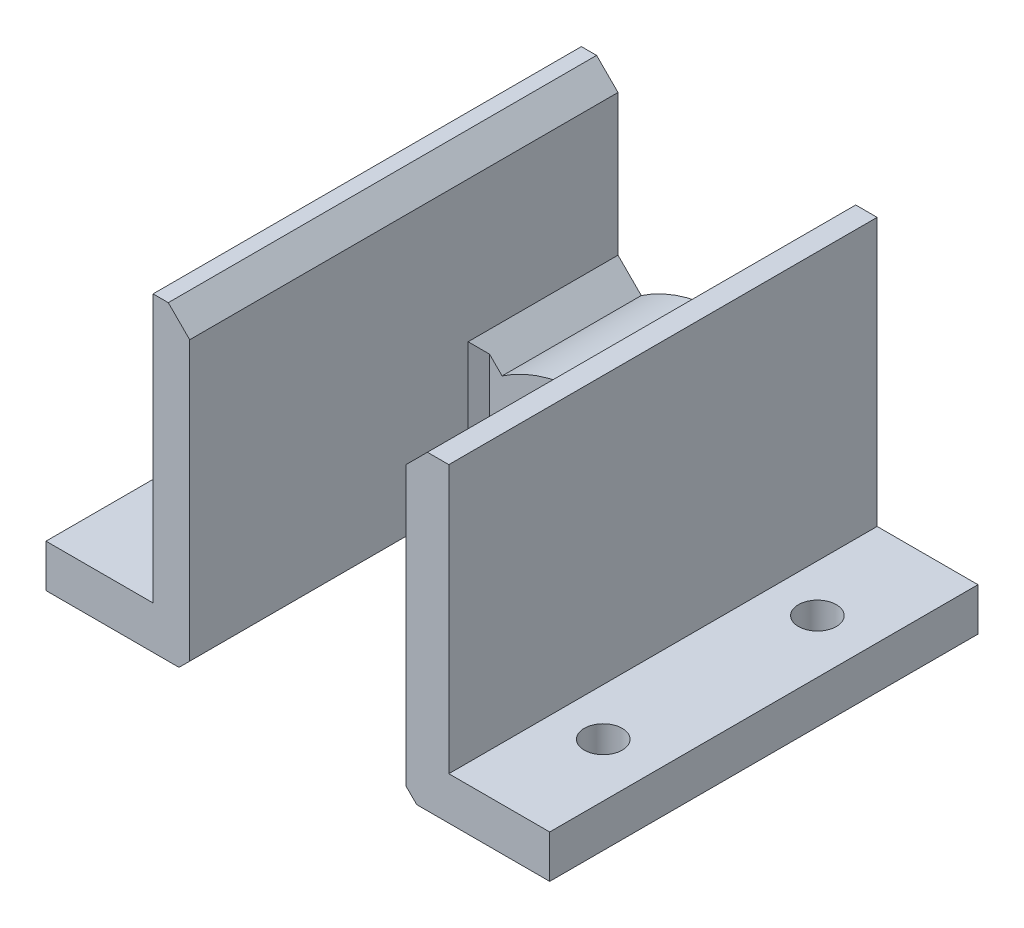
ISO-10303-21;
HEADER;
FILE_DESCRIPTION(('STEP AP214'),'2;1');
FILE_NAME('part.step','',(''),(''),'','','');
FILE_SCHEMA(('AUTOMOTIVE_DESIGN { 1 0 10303 214 1 1 1 1 }'));
ENDSEC;
DATA;
#1=APPLICATION_CONTEXT('core data for automotive mechanical design processes');
#2=APPLICATION_PROTOCOL_DEFINITION('international standard','automotive_design',2000,#1);
#3=PRODUCT_CONTEXT('',#1,'mechanical');
#4=PRODUCT('Part','Part','',(#3));
#5=PRODUCT_RELATED_PRODUCT_CATEGORY('part','',(#4));
#6=PRODUCT_DEFINITION_FORMATION('','',#4);
#7=PRODUCT_DEFINITION_CONTEXT('part definition',#1,'design');
#8=PRODUCT_DEFINITION('design','',#6,#7);
#9=PRODUCT_DEFINITION_SHAPE('','',#8);
#10=(LENGTH_UNIT() NAMED_UNIT(*) SI_UNIT(.MILLI.,.METRE.));
#11=(NAMED_UNIT(*) PLANE_ANGLE_UNIT() SI_UNIT($,.RADIAN.));
#12=(NAMED_UNIT(*) SI_UNIT($,.STERADIAN.) SOLID_ANGLE_UNIT());
#13=UNCERTAINTY_MEASURE_WITH_UNIT(LENGTH_MEASURE(1.E-05),#10,'distance_accuracy_value','');
#14=(GEOMETRIC_REPRESENTATION_CONTEXT(3) GLOBAL_UNCERTAINTY_ASSIGNED_CONTEXT((#13)) GLOBAL_UNIT_ASSIGNED_CONTEXT((#10,
#11,#12)) REPRESENTATION_CONTEXT('',''));
#15=CARTESIAN_POINT('',(0.,0.,0.));
#16=DIRECTION('',(0.,0.,1.));
#17=DIRECTION('',(1.,0.,0.));
#18=AXIS2_PLACEMENT_3D('',#15,#16,#17);
#19=CARTESIAN_POINT('',(0.,5.08,50.8));
#20=DIRECTION('',(0.,-1.,0.));
#21=DIRECTION('',(0.,0.,-1.));
#22=AXIS2_PLACEMENT_3D('',#19,#20,#21);
#23=PLANE('',#22);
#24=CARTESIAN_POINT('',(53.3926410749086,5.08,38.1));
#25=DIRECTION('',(0.,1.,0.));
#26=DIRECTION('',(0.,0.,1.));
#27=AXIS2_PLACEMENT_3D('',#24,#25,#26);
#28=CIRCLE('',#27,2.25);
#29=CARTESIAN_POINT('',(53.3926410749086,5.08,40.35));
#30=VERTEX_POINT('',#29);
#31=EDGE_CURVE('E271',#30,#30,#28,.T.);
#32=ORIENTED_EDGE('',*,*,#31,.F.);
#33=EDGE_LOOP('',(#32));
#34=FACE_BOUND('',#33,.T.);
#35=CARTESIAN_POINT('',(53.3926410749086,5.08,12.7));
#36=DIRECTION('',(0.,1.,0.));
#37=DIRECTION('',(0.,0.,1.));
#38=AXIS2_PLACEMENT_3D('',#35,#36,#37);
#39=CIRCLE('',#38,2.25);
#40=CARTESIAN_POINT('',(53.3926410749086,5.08,14.95));
#41=VERTEX_POINT('',#40);
#42=EDGE_CURVE('E282',#41,#41,#39,.F.);
#43=ORIENTED_EDGE('',*,*,#42,.T.);
#44=EDGE_LOOP('',(#43));
#45=FACE_BOUND('',#44,.T.);
#46=DIRECTION('',(0.,0.,-1.));
#47=VECTOR('',#46,1.);
#48=CARTESIAN_POINT('',(47.7783205374543,5.08,50.8));
#49=LINE('',#48,#47);
#50=CARTESIAN_POINT('',(47.7783205374543,5.08,50.8));
#51=VERTEX_POINT('',#50);
#52=CARTESIAN_POINT('',(47.7783205374543,5.08,0.));
#53=VERTEX_POINT('',#52);
#54=EDGE_CURVE('E246',#51,#53,#49,.T.);
#55=ORIENTED_EDGE('',*,*,#54,.F.);
#56=DIRECTION('',(-1.,0.,0.));
#57=VECTOR('',#56,1.);
#58=CARTESIAN_POINT('',(0.,5.08,50.8));
#59=LINE('',#58,#57);
#60=CARTESIAN_POINT('',(59.7426410749086,5.08,50.8));
#61=VERTEX_POINT('',#60);
#62=EDGE_CURVE('E305',#61,#51,#59,.T.);
#63=ORIENTED_EDGE('',*,*,#62,.F.);
#64=DIRECTION('',(0.,0.,-1.));
#65=VECTOR('',#64,1.);
#66=CARTESIAN_POINT('',(59.7426410749086,5.08,50.8));
#67=LINE('',#66,#65);
#68=CARTESIAN_POINT('',(59.7426410749086,5.08,0.));
#69=VERTEX_POINT('',#68);
#70=EDGE_CURVE('E336',#61,#69,#67,.T.);
#71=ORIENTED_EDGE('',*,*,#70,.T.);
#72=DIRECTION('',(-1.,0.,0.));
#73=VECTOR('',#72,1.);
#74=CARTESIAN_POINT('',(0.,5.08,0.));
#75=LINE('',#74,#73);
#76=EDGE_CURVE('E323',#69,#53,#75,.T.);
#77=ORIENTED_EDGE('',*,*,#76,.T.);
#78=EDGE_LOOP('',(#55,#63,#71,#77));
#79=FACE_BOUND('',#78,.T.);
#80=ADVANCED_FACE('F49',(#34,#45,#79),#23,.F.);
#81=CARTESIAN_POINT('',(0.,0.,50.8));
#82=DIRECTION('',(0.,1.,0.));
#83=DIRECTION('',(0.,0.,1.));
#84=AXIS2_PLACEMENT_3D('',#81,#82,#83);
#85=PLANE('',#84);
#86=DIRECTION('',(1.,0.,0.));
#87=VECTOR('',#86,1.);
#88=CARTESIAN_POINT('',(0.,0.,0.));
#89=LINE('',#88,#87);
#90=CARTESIAN_POINT('',(0.,0.,0.));
#91=VERTEX_POINT('',#90);
#92=CARTESIAN_POINT('',(15.7743205374543,0.,0.));
#93=VERTEX_POINT('',#92);
#94=EDGE_CURVE('E293',#91,#93,#89,.T.);
#95=ORIENTED_EDGE('',*,*,#94,.T.);
#96=DIRECTION('',(0.,0.,1.));
#97=VECTOR('',#96,1.);
#98=CARTESIAN_POINT('',(15.7743205374543,0.,16.51));
#99=LINE('',#98,#97);
#100=CARTESIAN_POINT('',(15.7743205374543,0.,50.8));
#101=VERTEX_POINT('',#100);
#102=EDGE_CURVE('E370',#93,#101,#99,.T.);
#103=ORIENTED_EDGE('',*,*,#102,.T.);
#104=DIRECTION('',(1.,0.,0.));
#105=VECTOR('',#104,1.);
#106=CARTESIAN_POINT('',(0.,0.,50.8));
#107=LINE('',#106,#105);
#108=CARTESIAN_POINT('',(0.,0.,50.8));
#109=VERTEX_POINT('',#108);
#110=EDGE_CURVE('E296',#109,#101,#107,.T.);
#111=ORIENTED_EDGE('',*,*,#110,.F.);
#112=DIRECTION('',(0.,0.,-1.));
#113=VECTOR('',#112,1.);
#114=CARTESIAN_POINT('',(0.,0.,50.8));
#115=LINE('',#114,#113);
#116=EDGE_CURVE('E313',#109,#91,#115,.T.);
#117=ORIENTED_EDGE('',*,*,#116,.T.);
#118=EDGE_LOOP('',(#95,#103,#111,#117));
#119=FACE_BOUND('',#118,.T.);
#120=CARTESIAN_POINT('',(6.35,0.,38.1));
#121=DIRECTION('',(0.,1.,0.));
#122=DIRECTION('',(0.,0.,1.));
#123=AXIS2_PLACEMENT_3D('',#120,#121,#122);
#124=CIRCLE('',#123,2.25);
#125=CARTESIAN_POINT('',(6.35,0.,40.35));
#126=VERTEX_POINT('',#125);
#127=EDGE_CURVE('E290',#126,#126,#124,.F.);
#128=ORIENTED_EDGE('',*,*,#127,.F.);
#129=EDGE_LOOP('',(#128));
#130=FACE_BOUND('',#129,.T.);
#131=CARTESIAN_POINT('',(6.35,0.,12.7));
#132=DIRECTION('',(0.,1.,0.));
#133=DIRECTION('',(0.,0.,1.));
#134=AXIS2_PLACEMENT_3D('',#131,#132,#133);
#135=CIRCLE('',#134,2.25);
#136=CARTESIAN_POINT('',(6.35,0.,14.95));
#137=VERTEX_POINT('',#136);
#138=EDGE_CURVE('E272',#137,#137,#135,.T.);
#139=ORIENTED_EDGE('',*,*,#138,.T.);
#140=EDGE_LOOP('',(#139));
#141=FACE_BOUND('',#140,.T.);
#142=ADVANCED_FACE('F458',(#119,#130,#141),#85,.F.);
#143=CARTESIAN_POINT('',(0.,0.,50.8));
#144=DIRECTION('',(0.,-1.,0.));
#145=DIRECTION('',(0.,0.,-1.));
#146=AXIS2_PLACEMENT_3D('',#143,#144,#145);
#147=PLANE('',#146);
#148=DIRECTION('',(-1.,0.,0.));
#149=VECTOR('',#148,1.);
#150=CARTESIAN_POINT('',(0.,0.,50.8));
#151=LINE('',#150,#149);
#152=CARTESIAN_POINT('',(59.7426410749086,0.,50.8));
#153=VERTEX_POINT('',#152);
#154=CARTESIAN_POINT('',(43.9683205374543,0.,50.8));
#155=VERTEX_POINT('',#154);
#156=EDGE_CURVE('E299',#153,#155,#151,.T.);
#157=ORIENTED_EDGE('',*,*,#156,.T.);
#158=DIRECTION('',(0.,0.,-1.));
#159=VECTOR('',#158,1.);
#160=CARTESIAN_POINT('',(43.9683205374543,0.,50.8));
#161=LINE('',#160,#159);
#162=CARTESIAN_POINT('',(43.9683205374543,0.,0.));
#163=VERTEX_POINT('',#162);
#164=EDGE_CURVE('E377',#155,#163,#161,.T.);
#165=ORIENTED_EDGE('',*,*,#164,.T.);
#166=DIRECTION('',(-1.,0.,0.));
#167=VECTOR('',#166,1.);
#168=CARTESIAN_POINT('',(0.,0.,0.));
#169=LINE('',#168,#167);
#170=CARTESIAN_POINT('',(59.7426410749086,0.,0.));
#171=VERTEX_POINT('',#170);
#172=EDGE_CURVE('E318',#171,#163,#169,.T.);
#173=ORIENTED_EDGE('',*,*,#172,.F.);
#174=DIRECTION('',(0.,0.,-1.));
#175=VECTOR('',#174,1.);
#176=CARTESIAN_POINT('',(59.7426410749086,0.,50.8));
#177=LINE('',#176,#175);
#178=EDGE_CURVE('E339',#153,#171,#177,.T.);
#179=ORIENTED_EDGE('',*,*,#178,.F.);
#180=EDGE_LOOP('',(#157,#165,#173,#179));
#181=FACE_BOUND('',#180,.T.);
#182=CARTESIAN_POINT('',(53.3926410749086,0.,12.7));
#183=DIRECTION('',(0.,1.,0.));
#184=DIRECTION('',(0.,0.,1.));
#185=AXIS2_PLACEMENT_3D('',#182,#183,#184);
#186=CIRCLE('',#185,2.25);
#187=CARTESIAN_POINT('',(53.3926410749086,0.,14.95));
#188=VERTEX_POINT('',#187);
#189=EDGE_CURVE('E279',#188,#188,#186,.F.);
#190=ORIENTED_EDGE('',*,*,#189,.F.);
#191=EDGE_LOOP('',(#190));
#192=FACE_BOUND('',#191,.T.);
#193=CARTESIAN_POINT('',(53.3926410749086,0.,38.1));
#194=DIRECTION('',(0.,1.,0.));
#195=DIRECTION('',(0.,0.,1.));
#196=AXIS2_PLACEMENT_3D('',#193,#194,#195);
#197=CIRCLE('',#196,2.25);
#198=CARTESIAN_POINT('',(53.3926410749086,0.,40.35));
#199=VERTEX_POINT('',#198);
#200=EDGE_CURVE('E285',#199,#199,#197,.T.);
#201=ORIENTED_EDGE('',*,*,#200,.T.);
#202=EDGE_LOOP('',(#201));
#203=FACE_BOUND('',#202,.T.);
#204=ADVANCED_FACE('F501',(#181,#192,#203),#147,.T.);
#205=CARTESIAN_POINT('',(29.8713205374543,0.,50.8));
#206=DIRECTION('',(0.,0.,-1.));
#207=DIRECTION('',(-1.,0.,0.));
#208=AXIS2_PLACEMENT_3D('',#205,#206,#207);
#209=CYLINDRICAL_SURFACE('',#208,12.827);
#210=DIRECTION('',(0.,0.,-1.));
#211=VECTOR('',#210,1.);
#212=CARTESIAN_POINT('',(42.6281138244185,1.34020671303586,50.8));
#213=LINE('',#212,#211);
#214=CARTESIAN_POINT('',(42.6281138244185,1.34020671303586,0.));
#215=VERTEX_POINT('',#214);
#216=CARTESIAN_POINT('',(42.6281138244185,1.34020671303586,17.7097932869641));
#217=VERTEX_POINT('',#216);
#218=EDGE_CURVE('E361',#215,#217,#213,.F.);
#219=ORIENTED_EDGE('',*,*,#218,.T.);
#220=CARTESIAN_POINT('',(29.8713205374543,0.,4.95299999999999));
#221=DIRECTION('',(-0.707106781186548,0.,0.707106781186548));
#222=DIRECTION('',(-0.707106781186548,0.,-0.707106781186548));
#223=AXIS2_PLACEMENT_3D('',#220,#221,#222);
#224=ELLIPSE('',#223,18.1401173645597,12.827);
#225=CARTESIAN_POINT('',(41.4283205374543,5.56486118425246,16.51));
#226=VERTEX_POINT('',#225);
#227=EDGE_CURVE('E399',#217,#226,#224,.T.);
#228=ORIENTED_EDGE('',*,*,#227,.T.);
#229=CARTESIAN_POINT('',(29.8713205374543,0.,16.51));
#230=DIRECTION('',(0.,0.,1.));
#231=DIRECTION('',(1.,0.,0.));
#232=AXIS2_PLACEMENT_3D('',#229,#230,#231);
#233=CIRCLE('',#232,12.827);
#234=CARTESIAN_POINT('',(18.3143205374543,5.56486118425249,16.51));
#235=VERTEX_POINT('',#234);
#236=EDGE_CURVE('E268',#226,#235,#233,.T.);
#237=ORIENTED_EDGE('',*,*,#236,.T.);
#238=CARTESIAN_POINT('',(29.8713205374543,0.,4.953));
#239=DIRECTION('',(0.707106781186548,0.,0.707106781186548));
#240=DIRECTION('',(0.707106781186548,0.,-0.707106781186548));
#241=AXIS2_PLACEMENT_3D('',#238,#239,#240);
#242=ELLIPSE('',#241,18.1401173645597,12.827);
#243=CARTESIAN_POINT('',(17.1145272504901,1.34020671303585,17.7097932869641));
#244=VERTEX_POINT('',#243);
#245=EDGE_CURVE('E391',#235,#244,#242,.T.);
#246=ORIENTED_EDGE('',*,*,#245,.T.);
#247=DIRECTION('',(0.,0.,-1.));
#248=VECTOR('',#247,1.);
#249=CARTESIAN_POINT('',(17.1145272504901,1.34020671303585,50.8));
#250=LINE('',#249,#248);
#251=CARTESIAN_POINT('',(17.1145272504902,1.34020671303585,0.));
#252=VERTEX_POINT('',#251);
#253=EDGE_CURVE('E363',#244,#252,#250,.T.);
#254=ORIENTED_EDGE('',*,*,#253,.T.);
#255=CARTESIAN_POINT('',(29.8713205374543,0.,0.));
#256=DIRECTION('',(0.,0.,1.));
#257=DIRECTION('',(1.,0.,0.));
#258=AXIS2_PLACEMENT_3D('',#255,#256,#257);
#259=CIRCLE('',#258,12.827);
#260=EDGE_CURVE('E316',#215,#252,#259,.T.);
#261=ORIENTED_EDGE('',*,*,#260,.F.);
#262=EDGE_LOOP('',(#219,#228,#237,#246,#254,#261));
#263=FACE_BOUND('',#262,.T.);
#264=ADVANCED_FACE('F439',(#263),#209,.F.);
#265=CARTESIAN_POINT('',(29.8713205374543,0.,50.8));
#266=DIRECTION('',(0.,0.,-1.));
#267=DIRECTION('',(-1.,0.,0.));
#268=AXIS2_PLACEMENT_3D('',#265,#266,#267);
#269=CYLINDRICAL_SURFACE('',#268,17.907);
#270=CARTESIAN_POINT('',(29.8713205374543,0.,0.));
#271=DIRECTION('',(0.,0.,1.));
#272=DIRECTION('',(1.,0.,0.));
#273=AXIS2_PLACEMENT_3D('',#270,#271,#272);
#274=CIRCLE('',#273,17.907);
#275=CARTESIAN_POINT('',(39.9348547979601,14.8116821187746,0.));
#276=VERTEX_POINT('',#275);
#277=CARTESIAN_POINT('',(19.8077862769486,14.8116821187746,0.));
#278=VERTEX_POINT('',#277);
#279=EDGE_CURVE('E326',#276,#278,#274,.T.);
#280=ORIENTED_EDGE('',*,*,#279,.T.);
#281=DIRECTION('',(0.,0.,-1.));
#282=VECTOR('',#281,1.);
#283=CARTESIAN_POINT('',(19.8077862769486,14.8116821187746,50.8));
#284=LINE('',#283,#282);
#285=CARTESIAN_POINT('',(19.8077862769486,14.8116821187746,16.51));
#286=VERTEX_POINT('',#285);
#287=EDGE_CURVE('E404',#278,#286,#284,.F.);
#288=ORIENTED_EDGE('',*,*,#287,.T.);
#289=CARTESIAN_POINT('',(29.8713205374543,0.,16.51));
#290=DIRECTION('',(0.,0.,1.));
#291=DIRECTION('',(1.,0.,0.));
#292=AXIS2_PLACEMENT_3D('',#289,#290,#291);
#293=CIRCLE('',#292,17.907);
#294=CARTESIAN_POINT('',(39.9348547979601,14.8116821187746,16.51));
#295=VERTEX_POINT('',#294);
#296=EDGE_CURVE('E341',#295,#286,#293,.T.);
#297=ORIENTED_EDGE('',*,*,#296,.F.);
#298=DIRECTION('',(0.,0.,-1.));
#299=VECTOR('',#298,1.);
#300=CARTESIAN_POINT('',(39.9348547979601,14.8116821187746,50.8));
#301=LINE('',#300,#299);
#302=EDGE_CURVE('E401',#295,#276,#301,.T.);
#303=ORIENTED_EDGE('',*,*,#302,.T.);
#304=EDGE_LOOP('',(#280,#288,#297,#303));
#305=FACE_BOUND('',#304,.T.);
#306=ADVANCED_FACE('F430',(#305),#269,.T.);
#307=CARTESIAN_POINT('',(0.,0.,50.8));
#308=DIRECTION('',(0.,0.,1.));
#309=DIRECTION('',(1.,0.,0.));
#310=AXIS2_PLACEMENT_3D('',#307,#308,#309);
#311=PLANE('',#310);
#312=ORIENTED_EDGE('',*,*,#110,.T.);
#313=DIRECTION('',(-0.70710678118655,-0.707106781186545,0.));
#314=VECTOR('',#313,1.);
#315=CARTESIAN_POINT('',(7.88716026872709,-7.88716026872715,50.8));
#316=LINE('',#315,#314);
#317=CARTESIAN_POINT('',(17.0443205374543,1.27000000000001,50.8));
#318=VERTEX_POINT('',#317);
#319=EDGE_CURVE('E372',#101,#318,#316,.F.);
#320=ORIENTED_EDGE('',*,*,#319,.T.);
#321=DIRECTION('',(0.,1.,0.));
#322=VECTOR('',#321,1.);
#323=CARTESIAN_POINT('',(17.0443205374543,-51.0533681552941,50.8));
#324=LINE('',#323,#322);
#325=CARTESIAN_POINT('',(17.0443205374543,34.29,50.8));
#326=VERTEX_POINT('',#325);
#327=EDGE_CURVE('E241',#318,#326,#324,.T.);
#328=ORIENTED_EDGE('',*,*,#327,.T.);
#329=DIRECTION('',(0.707106781186545,-0.70710678118655,0.));
#330=VECTOR('',#329,1.);
#331=CARTESIAN_POINT('',(25.6671602687272,25.667160268727,50.8));
#332=LINE('',#331,#330);
#333=CARTESIAN_POINT('',(14.5043205374543,36.83,50.8));
#334=VERTEX_POINT('',#333);
#335=EDGE_CURVE('E359',#326,#334,#332,.F.);
#336=ORIENTED_EDGE('',*,*,#335,.T.);
#337=DIRECTION('',(-1.,0.,0.));
#338=VECTOR('',#337,1.);
#339=CARTESIAN_POINT('',(0.,36.83,50.8));
#340=LINE('',#339,#338);
#341=CARTESIAN_POINT('',(12.7,36.83,50.8));
#342=VERTEX_POINT('',#341);
#343=EDGE_CURVE('E223',#334,#342,#340,.T.);
#344=ORIENTED_EDGE('',*,*,#343,.T.);
#345=DIRECTION('',(0.,1.,0.));
#346=VECTOR('',#345,1.);
#347=CARTESIAN_POINT('',(12.7,-51.0533681552941,50.8));
#348=LINE('',#347,#346);
#349=CARTESIAN_POINT('',(12.7,5.08,50.8));
#350=VERTEX_POINT('',#349);
#351=EDGE_CURVE('E235',#350,#342,#348,.T.);
#352=ORIENTED_EDGE('',*,*,#351,.F.);
#353=DIRECTION('',(1.,0.,0.));
#354=VECTOR('',#353,1.);
#355=CARTESIAN_POINT('',(0.,5.08,50.8));
#356=LINE('',#355,#354);
#357=CARTESIAN_POINT('',(0.,5.08,50.8));
#358=VERTEX_POINT('',#357);
#359=EDGE_CURVE('E308',#358,#350,#356,.T.);
#360=ORIENTED_EDGE('',*,*,#359,.F.);
#361=DIRECTION('',(0.,1.,0.));
#362=VECTOR('',#361,1.);
#363=CARTESIAN_POINT('',(0.,0.,50.8));
#364=LINE('',#363,#362);
#365=EDGE_CURVE('E310',#109,#358,#364,.T.);
#366=ORIENTED_EDGE('',*,*,#365,.F.);
#367=EDGE_LOOP('',(#312,#320,#328,#336,#344,#352,#360,#366));
#368=FACE_BOUND('',#367,.T.);
#369=ADVANCED_FACE('F453',(#368),#311,.T.);
#370=CARTESIAN_POINT('',(0.,5.08,50.8));
#371=DIRECTION('',(0.,1.,0.));
#372=DIRECTION('',(0.,0.,1.));
#373=AXIS2_PLACEMENT_3D('',#370,#371,#372);
#374=PLANE('',#373);
#375=CARTESIAN_POINT('',(6.35,5.08,38.1));
#376=DIRECTION('',(0.,1.,0.));
#377=DIRECTION('',(0.,0.,1.));
#378=AXIS2_PLACEMENT_3D('',#375,#376,#377);
#379=CIRCLE('',#378,2.25);
#380=CARTESIAN_POINT('',(6.35,5.08,40.35));
#381=VERTEX_POINT('',#380);
#382=EDGE_CURVE('E275',#381,#381,#379,.F.);
#383=ORIENTED_EDGE('',*,*,#382,.T.);
#384=EDGE_LOOP('',(#383));
#385=FACE_BOUND('',#384,.T.);
#386=DIRECTION('',(1.,0.,0.));
#387=VECTOR('',#386,1.);
#388=CARTESIAN_POINT('',(0.,5.08,0.));
#389=LINE('',#388,#387);
#390=CARTESIAN_POINT('',(0.,5.08,0.));
#391=VERTEX_POINT('',#390);
#392=CARTESIAN_POINT('',(12.7,5.08,0.));
#393=VERTEX_POINT('',#392);
#394=EDGE_CURVE('E232',#391,#393,#389,.T.);
#395=ORIENTED_EDGE('',*,*,#394,.F.);
#396=DIRECTION('',(0.,0.,-1.));
#397=VECTOR('',#396,1.);
#398=CARTESIAN_POINT('',(0.,5.08,50.8));
#399=LINE('',#398,#397);
#400=EDGE_CURVE('E332',#358,#391,#399,.T.);
#401=ORIENTED_EDGE('',*,*,#400,.F.);
#402=ORIENTED_EDGE('',*,*,#359,.T.);
#403=DIRECTION('',(0.,0.,-1.));
#404=VECTOR('',#403,1.);
#405=CARTESIAN_POINT('',(12.7,5.08,50.8));
#406=LINE('',#405,#404);
#407=EDGE_CURVE('E334',#350,#393,#406,.T.);
#408=ORIENTED_EDGE('',*,*,#407,.T.);
#409=EDGE_LOOP('',(#395,#401,#402,#408));
#410=FACE_BOUND('',#409,.T.);
#411=CARTESIAN_POINT('',(6.35,5.08,12.7));
#412=DIRECTION('',(0.,1.,0.));
#413=DIRECTION('',(0.,0.,1.));
#414=AXIS2_PLACEMENT_3D('',#411,#412,#413);
#415=CIRCLE('',#414,2.25);
#416=CARTESIAN_POINT('',(6.35,5.08,14.95));
#417=VERTEX_POINT('',#416);
#418=EDGE_CURVE('E276',#417,#417,#415,.T.);
#419=ORIENTED_EDGE('',*,*,#418,.F.);
#420=EDGE_LOOP('',(#419));
#421=FACE_BOUND('',#420,.T.);
#422=ADVANCED_FACE('F466',(#385,#410,#421),#374,.T.);
#423=CARTESIAN_POINT('',(59.7426410749086,0.,50.8));
#424=DIRECTION('',(-1.,0.,0.));
#425=DIRECTION('',(0.,0.,1.));
#426=AXIS2_PLACEMENT_3D('',#423,#424,#425);
#427=PLANE('',#426);
#428=DIRECTION('',(0.,1.,0.));
#429=VECTOR('',#428,1.);
#430=CARTESIAN_POINT('',(59.7426410749086,0.,0.));
#431=LINE('',#430,#429);
#432=EDGE_CURVE('E321',#171,#69,#431,.T.);
#433=ORIENTED_EDGE('',*,*,#432,.T.);
#434=ORIENTED_EDGE('',*,*,#70,.F.);
#435=DIRECTION('',(0.,1.,0.));
#436=VECTOR('',#435,1.);
#437=CARTESIAN_POINT('',(59.7426410749086,0.,50.8));
#438=LINE('',#437,#436);
#439=EDGE_CURVE('E303',#153,#61,#438,.T.);
#440=ORIENTED_EDGE('',*,*,#439,.F.);
#441=ORIENTED_EDGE('',*,*,#178,.T.);
#442=EDGE_LOOP('',(#433,#434,#440,#441));
#443=FACE_BOUND('',#442,.T.);
#444=ADVANCED_FACE('F497',(#443),#427,.F.);
#445=CARTESIAN_POINT('',(0.,0.,50.8));
#446=DIRECTION('',(-1.,0.,0.));
#447=DIRECTION('',(0.,0.,1.));
#448=AXIS2_PLACEMENT_3D('',#445,#446,#447);
#449=PLANE('',#448);
#450=DIRECTION('',(0.,1.,0.));
#451=VECTOR('',#450,1.);
#452=CARTESIAN_POINT('',(0.,0.,0.));
#453=LINE('',#452,#451);
#454=EDGE_CURVE('E300',#91,#391,#453,.T.);
#455=ORIENTED_EDGE('',*,*,#454,.F.);
#456=ORIENTED_EDGE('',*,*,#116,.F.);
#457=ORIENTED_EDGE('',*,*,#365,.T.);
#458=ORIENTED_EDGE('',*,*,#400,.T.);
#459=EDGE_LOOP('',(#455,#456,#457,#458));
#460=FACE_BOUND('',#459,.T.);
#461=ADVANCED_FACE('F463',(#460),#449,.T.);
#462=DIRECTION('',(0.,-1.,0.));
#463=VECTOR('',#462,1.);
#464=CARTESIAN_POINT('',(42.6983205374543,36.83,50.8));
#465=LINE('',#464,#463);
#466=CARTESIAN_POINT('',(42.6983205374543,34.29,50.8));
#467=VERTEX_POINT('',#466);
#468=CARTESIAN_POINT('',(42.6983205374543,1.27,50.8));
#469=VERTEX_POINT('',#468);
#470=EDGE_CURVE('E264',#467,#469,#465,.T.);
#471=ORIENTED_EDGE('',*,*,#470,.T.);
#472=DIRECTION('',(-0.707106781186545,0.70710678118655,0.));
#473=VECTOR('',#472,1.);
#474=CARTESIAN_POINT('',(21.9841602687273,21.9841602687272,50.8));
#475=LINE('',#474,#473);
#476=EDGE_CURVE('E382',#469,#155,#475,.F.);
#477=ORIENTED_EDGE('',*,*,#476,.T.);
#478=ORIENTED_EDGE('',*,*,#156,.F.);
#479=ORIENTED_EDGE('',*,*,#439,.T.);
#480=ORIENTED_EDGE('',*,*,#62,.T.);
#481=DIRECTION('',(0.,-1.,0.));
#482=VECTOR('',#481,1.);
#483=CARTESIAN_POINT('',(47.7783205374543,36.83,50.8));
#484=LINE('',#483,#482);
#485=CARTESIAN_POINT('',(47.7783205374543,36.83,50.8));
#486=VERTEX_POINT('',#485);
#487=EDGE_CURVE('E262',#486,#51,#484,.T.);
#488=ORIENTED_EDGE('',*,*,#487,.F.);
#489=DIRECTION('',(1.,0.,0.));
#490=VECTOR('',#489,1.);
#491=CARTESIAN_POINT('',(0.,36.83,50.8));
#492=LINE('',#491,#490);
#493=CARTESIAN_POINT('',(45.2383205374543,36.83,50.8));
#494=VERTEX_POINT('',#493);
#495=EDGE_CURVE('E249',#494,#486,#492,.T.);
#496=ORIENTED_EDGE('',*,*,#495,.F.);
#497=DIRECTION('',(0.707106781186548,0.707106781186547,0.));
#498=VECTOR('',#497,1.);
#499=CARTESIAN_POINT('',(4.2041602687271,-4.20416026872711,50.8));
#500=LINE('',#499,#498);
#501=EDGE_CURVE('E353',#494,#467,#500,.F.);
#502=ORIENTED_EDGE('',*,*,#501,.T.);
#503=EDGE_LOOP('',(#471,#477,#478,#479,#480,#488,#496,#502));
#504=FACE_BOUND('',#503,.T.);
#505=ADVANCED_FACE('F511',(#504),#311,.T.);
#506=CARTESIAN_POINT('',(0.,0.,0.));
#507=DIRECTION('',(0.,0.,1.));
#508=DIRECTION('',(1.,0.,0.));
#509=AXIS2_PLACEMENT_3D('',#506,#507,#508);
#510=PLANE('',#509);
#511=ORIENTED_EDGE('',*,*,#260,.T.);
#512=DIRECTION('',(0.70710678118655,0.707106781186545,0.));
#513=VECTOR('',#512,1.);
#514=CARTESIAN_POINT('',(17.1145272504902,1.34020671303585,0.));
#515=LINE('',#514,#513);
#516=EDGE_CURVE('E368',#252,#93,#515,.F.);
#517=ORIENTED_EDGE('',*,*,#516,.T.);
#518=ORIENTED_EDGE('',*,*,#94,.F.);
#519=ORIENTED_EDGE('',*,*,#454,.T.);
#520=ORIENTED_EDGE('',*,*,#394,.T.);
#521=DIRECTION('',(0.,1.,0.));
#522=VECTOR('',#521,1.);
#523=CARTESIAN_POINT('',(12.7,-51.0533681552941,0.));
#524=LINE('',#523,#522);
#525=CARTESIAN_POINT('',(12.7,36.83,0.));
#526=VERTEX_POINT('',#525);
#527=EDGE_CURVE('E227',#393,#526,#524,.T.);
#528=ORIENTED_EDGE('',*,*,#527,.T.);
#529=DIRECTION('',(-1.,0.,0.));
#530=VECTOR('',#529,1.);
#531=CARTESIAN_POINT('',(0.,36.83,0.));
#532=LINE('',#531,#530);
#533=CARTESIAN_POINT('',(14.5043205374543,36.83,0.));
#534=VERTEX_POINT('',#533);
#535=EDGE_CURVE('E213',#534,#526,#532,.T.);
#536=ORIENTED_EDGE('',*,*,#535,.F.);
#537=DIRECTION('',(-0.707106781186545,0.70710678118655,0.));
#538=VECTOR('',#537,1.);
#539=CARTESIAN_POINT('',(14.5043205374543,36.83,0.));
#540=LINE('',#539,#538);
#541=CARTESIAN_POINT('',(17.0443205374543,34.29,0.));
#542=VERTEX_POINT('',#541);
#543=EDGE_CURVE('E347',#534,#542,#540,.F.);
#544=ORIENTED_EDGE('',*,*,#543,.T.);
#545=DIRECTION('',(0.,1.,0.));
#546=VECTOR('',#545,1.);
#547=CARTESIAN_POINT('',(17.0443205374543,-51.0533681552941,0.));
#548=LINE('',#547,#546);
#549=CARTESIAN_POINT('',(17.0443205374543,17.5751478582688,0.));
#550=VERTEX_POINT('',#549);
#551=EDGE_CURVE('E236',#550,#542,#548,.T.);
#552=ORIENTED_EDGE('',*,*,#551,.F.);
#553=DIRECTION('',(-0.707106781186551,0.707106781186544,0.));
#554=VECTOR('',#553,1.);
#555=CARTESIAN_POINT('',(17.3097341978615,17.3097341978617,0.));
#556=LINE('',#555,#554);
#557=EDGE_CURVE('E416',#550,#278,#556,.F.);
#558=ORIENTED_EDGE('',*,*,#557,.T.);
#559=ORIENTED_EDGE('',*,*,#279,.F.);
#560=DIRECTION('',(0.707106781186551,0.707106781186544,0.));
#561=VECTOR('',#560,1.);
#562=CARTESIAN_POINT('',(12.5615863395926,-12.5615863395927,0.));
#563=LINE('',#562,#561);
#564=CARTESIAN_POINT('',(42.6983205374543,17.5751478582688,0.));
#565=VERTEX_POINT('',#564);
#566=EDGE_CURVE('E418',#276,#565,#563,.T.);
#567=ORIENTED_EDGE('',*,*,#566,.T.);
#568=DIRECTION('',(0.,-1.,0.));
#569=VECTOR('',#568,1.);
#570=CARTESIAN_POINT('',(42.6983205374543,36.83,0.));
#571=LINE('',#570,#569);
#572=CARTESIAN_POINT('',(42.6983205374543,34.29,0.));
#573=VERTEX_POINT('',#572);
#574=EDGE_CURVE('E256',#573,#565,#571,.T.);
#575=ORIENTED_EDGE('',*,*,#574,.F.);
#576=DIRECTION('',(-0.707106781186548,-0.707106781186547,0.));
#577=VECTOR('',#576,1.);
#578=CARTESIAN_POINT('',(42.6983205374543,34.29,0.));
#579=LINE('',#578,#577);
#580=CARTESIAN_POINT('',(45.2383205374543,36.83,0.));
#581=VERTEX_POINT('',#580);
#582=EDGE_CURVE('E349',#573,#581,#579,.F.);
#583=ORIENTED_EDGE('',*,*,#582,.T.);
#584=DIRECTION('',(-1.,0.,0.));
#585=VECTOR('',#584,1.);
#586=CARTESIAN_POINT('',(0.,36.83,0.));
#587=LINE('',#586,#585);
#588=CARTESIAN_POINT('',(47.7783205374543,36.83,0.));
#589=VERTEX_POINT('',#588);
#590=EDGE_CURVE('E253',#589,#581,#587,.T.);
#591=ORIENTED_EDGE('',*,*,#590,.F.);
#592=DIRECTION('',(0.,-1.,0.));
#593=VECTOR('',#592,1.);
#594=CARTESIAN_POINT('',(47.7783205374543,36.83,0.));
#595=LINE('',#594,#593);
#596=EDGE_CURVE('E259',#589,#53,#595,.T.);
#597=ORIENTED_EDGE('',*,*,#596,.T.);
#598=ORIENTED_EDGE('',*,*,#76,.F.);
#599=ORIENTED_EDGE('',*,*,#432,.F.);
#600=ORIENTED_EDGE('',*,*,#172,.T.);
#601=DIRECTION('',(0.707106781186545,-0.70710678118655,0.));
#602=VECTOR('',#601,1.);
#603=CARTESIAN_POINT('',(43.9683205374543,0.,0.));
#604=LINE('',#603,#602);
#605=EDGE_CURVE('E366',#163,#215,#604,.F.);
#606=ORIENTED_EDGE('',*,*,#605,.T.);
#607=EDGE_LOOP('',(#511,#517,#518,#519,#520,#528,#536,#544,#552,#558,#559,#567,#575,#583,#591,
#597,#598,#599,#600,#606));
#608=FACE_BOUND('',#607,.T.);
#609=ADVANCED_FACE('F229',(#608),#510,.F.);
#610=CARTESIAN_POINT('',(6.35,0.,38.1));
#611=DIRECTION('',(0.,1.,0.));
#612=DIRECTION('',(0.,0.,1.));
#613=AXIS2_PLACEMENT_3D('',#610,#611,#612);
#614=CYLINDRICAL_SURFACE('',#613,2.25);
#615=ORIENTED_EDGE('',*,*,#127,.T.);
#616=EDGE_LOOP('',(#615));
#617=FACE_BOUND('',#616,.T.);
#618=ORIENTED_EDGE('',*,*,#382,.F.);
#619=EDGE_LOOP('',(#618));
#620=FACE_BOUND('',#619,.T.);
#621=ADVANCED_FACE('F519',(#617,#620),#614,.F.);
#622=CARTESIAN_POINT('',(6.35,0.,12.7));
#623=DIRECTION('',(0.,1.,0.));
#624=DIRECTION('',(0.,0.,1.));
#625=AXIS2_PLACEMENT_3D('',#622,#623,#624);
#626=CYLINDRICAL_SURFACE('',#625,2.25);
#627=ORIENTED_EDGE('',*,*,#138,.F.);
#628=EDGE_LOOP('',(#627));
#629=FACE_BOUND('',#628,.T.);
#630=ORIENTED_EDGE('',*,*,#418,.T.);
#631=EDGE_LOOP('',(#630));
#632=FACE_BOUND('',#631,.T.);
#633=ADVANCED_FACE('F735',(#629,#632),#626,.F.);
#634=CARTESIAN_POINT('',(53.3926410749086,0.,12.7));
#635=DIRECTION('',(0.,1.,0.));
#636=DIRECTION('',(0.,0.,1.));
#637=AXIS2_PLACEMENT_3D('',#634,#635,#636);
#638=CYLINDRICAL_SURFACE('',#637,2.25);
#639=ORIENTED_EDGE('',*,*,#189,.T.);
#640=EDGE_LOOP('',(#639));
#641=FACE_BOUND('',#640,.T.);
#642=ORIENTED_EDGE('',*,*,#42,.F.);
#643=EDGE_LOOP('',(#642));
#644=FACE_BOUND('',#643,.T.);
#645=ADVANCED_FACE('F738',(#641,#644),#638,.F.);
#646=CARTESIAN_POINT('',(53.3926410749086,0.,38.1));
#647=DIRECTION('',(0.,1.,0.));
#648=DIRECTION('',(0.,0.,1.));
#649=AXIS2_PLACEMENT_3D('',#646,#647,#648);
#650=CYLINDRICAL_SURFACE('',#649,2.25);
#651=ORIENTED_EDGE('',*,*,#200,.F.);
#652=EDGE_LOOP('',(#651));
#653=FACE_BOUND('',#652,.T.);
#654=ORIENTED_EDGE('',*,*,#31,.T.);
#655=EDGE_LOOP('',(#654));
#656=FACE_BOUND('',#655,.T.);
#657=ADVANCED_FACE('F674',(#653,#656),#650,.F.);
#658=CARTESIAN_POINT('',(0.,0.,16.51));
#659=DIRECTION('',(0.,0.,1.));
#660=DIRECTION('',(1.,0.,0.));
#661=AXIS2_PLACEMENT_3D('',#658,#659,#660);
#662=PLANE('',#661);
#663=DIRECTION('',(0.,1.,0.));
#664=VECTOR('',#663,1.);
#665=CARTESIAN_POINT('',(41.4283205374543,12.4951478582688,16.51));
#666=LINE('',#665,#664);
#667=CARTESIAN_POINT('',(41.4283205374543,16.3051478582688,16.51));
#668=VERTEX_POINT('',#667);
#669=EDGE_CURVE('E64',#226,#668,#666,.T.);
#670=ORIENTED_EDGE('',*,*,#669,.T.);
#671=DIRECTION('',(-0.707106781186551,-0.707106781186544,0.));
#672=VECTOR('',#671,1.);
#673=CARTESIAN_POINT('',(39.9348547979601,14.8116821187746,16.51));
#674=LINE('',#673,#672);
#675=EDGE_CURVE('E11',#668,#295,#674,.T.);
#676=ORIENTED_EDGE('',*,*,#675,.T.);
#677=ORIENTED_EDGE('',*,*,#296,.T.);
#678=DIRECTION('',(0.707106781186551,-0.707106781186544,0.));
#679=VECTOR('',#678,1.);
#680=CARTESIAN_POINT('',(19.8077862769486,14.8116821187746,16.51));
#681=LINE('',#680,#679);
#682=CARTESIAN_POINT('',(18.3143205374543,16.3051478582689,16.51));
#683=VERTEX_POINT('',#682);
#684=EDGE_CURVE('E412',#286,#683,#681,.F.);
#685=ORIENTED_EDGE('',*,*,#684,.T.);
#686=DIRECTION('',(0.,-1.,0.));
#687=VECTOR('',#686,1.);
#688=CARTESIAN_POINT('',(18.3143205374543,1.27000000000001,16.51));
#689=LINE('',#688,#687);
#690=EDGE_CURVE('E72',#683,#235,#689,.T.);
#691=ORIENTED_EDGE('',*,*,#690,.T.);
#692=ORIENTED_EDGE('',*,*,#236,.F.);
#693=EDGE_LOOP('',(#670,#676,#677,#685,#691,#692));
#694=FACE_BOUND('',#693,.T.);
#695=ADVANCED_FACE('F428',(#694),#662,.T.);
#696=CARTESIAN_POINT('',(47.7783205374543,36.83,0.));
#697=DIRECTION('',(-1.,0.,0.));
#698=DIRECTION('',(0.,0.,1.));
#699=AXIS2_PLACEMENT_3D('',#696,#697,#698);
#700=PLANE('',#699);
#701=ORIENTED_EDGE('',*,*,#487,.T.);
#702=ORIENTED_EDGE('',*,*,#54,.T.);
#703=ORIENTED_EDGE('',*,*,#596,.F.);
#704=DIRECTION('',(0.,0.,-1.));
#705=VECTOR('',#704,1.);
#706=CARTESIAN_POINT('',(47.7783205374543,36.83,0.));
#707=LINE('',#706,#705);
#708=EDGE_CURVE('E251',#486,#589,#707,.T.);
#709=ORIENTED_EDGE('',*,*,#708,.F.);
#710=EDGE_LOOP('',(#701,#702,#703,#709));
#711=FACE_BOUND('',#710,.T.);
#712=ADVANCED_FACE('F488',(#711),#700,.F.);
#713=CARTESIAN_POINT('',(42.6983205374543,36.83,0.));
#714=DIRECTION('',(-1.,0.,0.));
#715=DIRECTION('',(0.,0.,1.));
#716=AXIS2_PLACEMENT_3D('',#713,#714,#715);
#717=PLANE('',#716);
#718=ORIENTED_EDGE('',*,*,#574,.T.);
#719=DIRECTION('',(0.,0.,1.));
#720=VECTOR('',#719,1.);
#721=CARTESIAN_POINT('',(42.6983205374543,17.5751478582688,0.));
#722=LINE('',#721,#720);
#723=CARTESIAN_POINT('',(42.6983205374543,17.5751478582688,17.78));
#724=VERTEX_POINT('',#723);
#725=EDGE_CURVE('E409',#565,#724,#722,.T.);
#726=ORIENTED_EDGE('',*,*,#725,.T.);
#727=DIRECTION('',(0.,-1.,0.));
#728=VECTOR('',#727,1.);
#729=CARTESIAN_POINT('',(42.6983205374543,1.27,17.78));
#730=LINE('',#729,#728);
#731=CARTESIAN_POINT('',(42.6983205374543,1.27,17.78));
#732=VERTEX_POINT('',#731);
#733=EDGE_CURVE('E388',#724,#732,#730,.T.);
#734=ORIENTED_EDGE('',*,*,#733,.T.);
#735=DIRECTION('',(0.,0.,-1.));
#736=VECTOR('',#735,1.);
#737=CARTESIAN_POINT('',(42.6983205374543,1.27,0.));
#738=LINE('',#737,#736);
#739=EDGE_CURVE('E380',#732,#469,#738,.F.);
#740=ORIENTED_EDGE('',*,*,#739,.T.);
#741=ORIENTED_EDGE('',*,*,#470,.F.);
#742=DIRECTION('',(0.,0.,-1.));
#743=VECTOR('',#742,1.);
#744=CARTESIAN_POINT('',(42.6983205374543,34.29,0.));
#745=LINE('',#744,#743);
#746=EDGE_CURVE('E344',#467,#573,#745,.T.);
#747=ORIENTED_EDGE('',*,*,#746,.T.);
#748=EDGE_LOOP('',(#718,#726,#734,#740,#741,#747));
#749=FACE_BOUND('',#748,.T.);
#750=ADVANCED_FACE('F473',(#749),#717,.T.);
#751=CARTESIAN_POINT('',(0.,36.83,0.));
#752=DIRECTION('',(0.,1.,0.));
#753=DIRECTION('',(0.,0.,1.));
#754=AXIS2_PLACEMENT_3D('',#751,#752,#753);
#755=PLANE('',#754);
#756=ORIENTED_EDGE('',*,*,#590,.T.);
#757=DIRECTION('',(0.,0.,1.));
#758=VECTOR('',#757,1.);
#759=CARTESIAN_POINT('',(45.2383205374543,36.83,0.));
#760=LINE('',#759,#758);
#761=EDGE_CURVE('E351',#581,#494,#760,.T.);
#762=ORIENTED_EDGE('',*,*,#761,.T.);
#763=ORIENTED_EDGE('',*,*,#495,.T.);
#764=ORIENTED_EDGE('',*,*,#708,.T.);
#765=EDGE_LOOP('',(#756,#762,#763,#764));
#766=FACE_BOUND('',#765,.T.);
#767=ADVANCED_FACE('F482',(#766),#755,.T.);
#768=CARTESIAN_POINT('',(17.0443205374543,-51.0533681552941,0.));
#769=DIRECTION('',(1.,0.,0.));
#770=DIRECTION('',(0.,0.,-1.));
#771=AXIS2_PLACEMENT_3D('',#768,#769,#770);
#772=PLANE('',#771);
#773=DIRECTION('',(0.,1.,0.));
#774=VECTOR('',#773,1.);
#775=CARTESIAN_POINT('',(17.0443205374543,12.4951478582688,17.78));
#776=LINE('',#775,#774);
#777=CARTESIAN_POINT('',(17.0443205374543,1.27000000000001,17.78));
#778=VERTEX_POINT('',#777);
#779=CARTESIAN_POINT('',(17.0443205374543,17.5751478582688,17.78));
#780=VERTEX_POINT('',#779);
#781=EDGE_CURVE('E384',#778,#780,#776,.T.);
#782=ORIENTED_EDGE('',*,*,#781,.T.);
#783=DIRECTION('',(0.,0.,-1.));
#784=VECTOR('',#783,1.);
#785=CARTESIAN_POINT('',(17.0443205374543,17.5751478582688,0.));
#786=LINE('',#785,#784);
#787=EDGE_CURVE('E407',#780,#550,#786,.T.);
#788=ORIENTED_EDGE('',*,*,#787,.T.);
#789=ORIENTED_EDGE('',*,*,#551,.T.);
#790=DIRECTION('',(0.,0.,1.));
#791=VECTOR('',#790,1.);
#792=CARTESIAN_POINT('',(17.0443205374543,34.29,0.));
#793=LINE('',#792,#791);
#794=EDGE_CURVE('E356',#542,#326,#793,.T.);
#795=ORIENTED_EDGE('',*,*,#794,.T.);
#796=ORIENTED_EDGE('',*,*,#327,.F.);
#797=DIRECTION('',(0.,0.,1.));
#798=VECTOR('',#797,1.);
#799=CARTESIAN_POINT('',(17.0443205374543,1.27000000000001,0.));
#800=LINE('',#799,#798);
#801=EDGE_CURVE('E374',#318,#778,#800,.F.);
#802=ORIENTED_EDGE('',*,*,#801,.T.);
#803=EDGE_LOOP('',(#782,#788,#789,#795,#796,#802));
#804=FACE_BOUND('',#803,.T.);
#805=ADVANCED_FACE('F449',(#804),#772,.T.);
#806=CARTESIAN_POINT('',(12.7,-51.0533681552941,0.));
#807=DIRECTION('',(1.,0.,0.));
#808=DIRECTION('',(0.,0.,-1.));
#809=AXIS2_PLACEMENT_3D('',#806,#807,#808);
#810=PLANE('',#809);
#811=ORIENTED_EDGE('',*,*,#407,.F.);
#812=ORIENTED_EDGE('',*,*,#351,.T.);
#813=DIRECTION('',(0.,0.,-1.));
#814=VECTOR('',#813,1.);
#815=CARTESIAN_POINT('',(12.7,36.83,0.));
#816=LINE('',#815,#814);
#817=EDGE_CURVE('E218',#342,#526,#816,.T.);
#818=ORIENTED_EDGE('',*,*,#817,.T.);
#819=ORIENTED_EDGE('',*,*,#527,.F.);
#820=EDGE_LOOP('',(#811,#812,#818,#819));
#821=FACE_BOUND('',#820,.T.);
#822=ADVANCED_FACE('F239',(#821),#810,.F.);
#823=CARTESIAN_POINT('',(0.,36.83,0.));
#824=DIRECTION('',(0.,1.,0.));
#825=DIRECTION('',(0.,0.,1.));
#826=AXIS2_PLACEMENT_3D('',#823,#824,#825);
#827=PLANE('',#826);
#828=ORIENTED_EDGE('',*,*,#343,.F.);
#829=DIRECTION('',(0.,0.,-1.));
#830=VECTOR('',#829,1.);
#831=CARTESIAN_POINT('',(14.5043205374543,36.83,0.));
#832=LINE('',#831,#830);
#833=EDGE_CURVE('E220',#334,#534,#832,.T.);
#834=ORIENTED_EDGE('',*,*,#833,.T.);
#835=ORIENTED_EDGE('',*,*,#535,.T.);
#836=ORIENTED_EDGE('',*,*,#817,.F.);
#837=EDGE_LOOP('',(#828,#834,#835,#836));
#838=FACE_BOUND('',#837,.T.);
#839=ADVANCED_FACE('F216',(#838),#827,.T.);
#840=CARTESIAN_POINT('',(42.6983205374543,34.29,0.));
#841=DIRECTION('',(0.707106781186547,-0.707106781186548,0.));
#842=DIRECTION('',(0.,0.,-1.));
#843=AXIS2_PLACEMENT_3D('',#840,#841,#842);
#844=PLANE('',#843);
#845=ORIENTED_EDGE('',*,*,#501,.F.);
#846=ORIENTED_EDGE('',*,*,#761,.F.);
#847=ORIENTED_EDGE('',*,*,#582,.F.);
#848=ORIENTED_EDGE('',*,*,#746,.F.);
#849=EDGE_LOOP('',(#845,#846,#847,#848));
#850=FACE_BOUND('',#849,.T.);
#851=ADVANCED_FACE('F478',(#850),#844,.F.);
#852=CARTESIAN_POINT('',(14.5043205374543,36.83,0.));
#853=DIRECTION('',(-0.70710678118655,-0.707106781186545,0.));
#854=DIRECTION('',(0.,0.,-1.));
#855=AXIS2_PLACEMENT_3D('',#852,#853,#854);
#856=PLANE('',#855);
#857=ORIENTED_EDGE('',*,*,#335,.F.);
#858=ORIENTED_EDGE('',*,*,#794,.F.);
#859=ORIENTED_EDGE('',*,*,#543,.F.);
#860=ORIENTED_EDGE('',*,*,#833,.F.);
#861=EDGE_LOOP('',(#857,#858,#859,#860));
#862=FACE_BOUND('',#861,.T.);
#863=ADVANCED_FACE('F469',(#862),#856,.F.);
#864=CARTESIAN_POINT('',(17.1145272504902,1.34020671303585,50.8));
#865=DIRECTION('',(-0.707106781186545,0.70710678118655,0.));
#866=DIRECTION('',(0.,0.,-1.));
#867=AXIS2_PLACEMENT_3D('',#864,#865,#866);
#868=PLANE('',#867);
#869=ORIENTED_EDGE('',*,*,#319,.F.);
#870=ORIENTED_EDGE('',*,*,#102,.F.);
#871=ORIENTED_EDGE('',*,*,#516,.F.);
#872=ORIENTED_EDGE('',*,*,#253,.F.);
#873=DIRECTION('',(-0.577350269189627,-0.577350269189623,0.577350269189627));
#874=VECTOR('',#873,1.);
#875=CARTESIAN_POINT('',(-0.396802180977023,-16.1711227184312,35.2211227184313));
#876=LINE('',#875,#874);
#877=EDGE_CURVE('E394',#244,#778,#876,.T.);
#878=ORIENTED_EDGE('',*,*,#877,.T.);
#879=ORIENTED_EDGE('',*,*,#801,.F.);
#880=EDGE_LOOP('',(#869,#870,#871,#872,#878,#879));
#881=FACE_BOUND('',#880,.T.);
#882=ADVANCED_FACE('F446',(#881),#868,.F.);
#883=CARTESIAN_POINT('',(43.9683205374543,0.,50.8));
#884=DIRECTION('',(0.70710678118655,0.707106781186545,0.));
#885=DIRECTION('',(0.,0.,-1.));
#886=AXIS2_PLACEMENT_3D('',#883,#884,#885);
#887=PLANE('',#886);
#888=ORIENTED_EDGE('',*,*,#739,.F.);
#889=DIRECTION('',(-0.577350269189624,0.577350269189629,-0.577350269189624));
#890=VECTOR('',#889,1.);
#891=CARTESIAN_POINT('',(30.8449872041209,13.1233333333335,5.92666666666662));
#892=LINE('',#891,#890);
#893=EDGE_CURVE('E396',#732,#217,#892,.T.);
#894=ORIENTED_EDGE('',*,*,#893,.T.);
#895=ORIENTED_EDGE('',*,*,#218,.F.);
#896=ORIENTED_EDGE('',*,*,#605,.F.);
#897=ORIENTED_EDGE('',*,*,#164,.F.);
#898=ORIENTED_EDGE('',*,*,#476,.F.);
#899=EDGE_LOOP('',(#888,#894,#895,#896,#897,#898));
#900=FACE_BOUND('',#899,.T.);
#901=ADVANCED_FACE('F507',(#900),#887,.F.);
#902=CARTESIAN_POINT('',(17.0443205374543,-51.0533681552941,17.78));
#903=DIRECTION('',(0.707106781186548,0.,0.707106781186548));
#904=DIRECTION('',(0.,-1.,0.));
#905=AXIS2_PLACEMENT_3D('',#902,#903,#904);
#906=PLANE('',#905);
#907=ORIENTED_EDGE('',*,*,#245,.F.);
#908=ORIENTED_EDGE('',*,*,#690,.F.);
#909=DIRECTION('',(-0.577350269189627,0.577350269189622,0.577350269189627));
#910=VECTOR('',#909,1.);
#911=CARTESIAN_POINT('',(39.9204925419752,-5.30102414625189,-5.09617200452093));
#912=LINE('',#911,#910);
#913=EDGE_CURVE('E414',#683,#780,#912,.T.);
#914=ORIENTED_EDGE('',*,*,#913,.T.);
#915=ORIENTED_EDGE('',*,*,#781,.F.);
#916=ORIENTED_EDGE('',*,*,#877,.F.);
#917=EDGE_LOOP('',(#907,#908,#914,#915,#916));
#918=FACE_BOUND('',#917,.T.);
#919=ADVANCED_FACE('F441',(#918),#906,.T.);
#920=CARTESIAN_POINT('',(42.6983205374543,36.83,17.78));
#921=DIRECTION('',(-0.707106781186548,0.,0.707106781186548));
#922=DIRECTION('',(0.,1.,0.));
#923=AXIS2_PLACEMENT_3D('',#920,#921,#922);
#924=PLANE('',#923);
#925=ORIENTED_EDGE('',*,*,#733,.F.);
#926=DIRECTION('',(0.577350269189628,0.577350269189622,0.577350269189628));
#927=VECTOR('',#926,1.);
#928=CARTESIAN_POINT('',(49.116604584698,23.9934319055125,24.1982840472437));
#929=LINE('',#928,#927);
#930=EDGE_CURVE('E58',#724,#668,#929,.F.);
#931=ORIENTED_EDGE('',*,*,#930,.T.);
#932=ORIENTED_EDGE('',*,*,#669,.F.);
#933=ORIENTED_EDGE('',*,*,#227,.F.);
#934=ORIENTED_EDGE('',*,*,#893,.F.);
#935=EDGE_LOOP('',(#925,#931,#932,#933,#934));
#936=FACE_BOUND('',#935,.T.);
#937=ADVANCED_FACE('F422',(#936),#924,.T.);
#938=CARTESIAN_POINT('',(19.8077862769486,14.8116821187746,50.8));
#939=DIRECTION('',(0.707106781186545,0.707106781186551,0.));
#940=DIRECTION('',(0.,0.,-1.));
#941=AXIS2_PLACEMENT_3D('',#938,#939,#940);
#942=PLANE('',#941);
#943=ORIENTED_EDGE('',*,*,#557,.F.);
#944=ORIENTED_EDGE('',*,*,#787,.F.);
#945=ORIENTED_EDGE('',*,*,#913,.F.);
#946=ORIENTED_EDGE('',*,*,#684,.F.);
#947=ORIENTED_EDGE('',*,*,#287,.F.);
#948=EDGE_LOOP('',(#943,#944,#945,#946,#947));
#949=FACE_BOUND('',#948,.T.);
#950=ADVANCED_FACE('F435',(#949),#942,.T.);
#951=CARTESIAN_POINT('',(39.9348547979601,14.8116821187746,50.8));
#952=DIRECTION('',(0.707106781186544,-0.707106781186551,0.));
#953=DIRECTION('',(0.,0.,-1.));
#954=AXIS2_PLACEMENT_3D('',#951,#952,#953);
#955=PLANE('',#954);
#956=ORIENTED_EDGE('',*,*,#930,.F.);
#957=ORIENTED_EDGE('',*,*,#725,.F.);
#958=ORIENTED_EDGE('',*,*,#566,.F.);
#959=ORIENTED_EDGE('',*,*,#302,.F.);
#960=ORIENTED_EDGE('',*,*,#675,.F.);
#961=EDGE_LOOP('',(#956,#957,#958,#959,#960));
#962=FACE_BOUND('',#961,.T.);
#963=ADVANCED_FACE('F52',(#962),#955,.F.);
#964=CLOSED_SHELL('',(#80,#142,#204,#264,#306,#369,#422,#444,#461,#505,#609,#621,#633,#645,#657,
#695,#712,#750,#767,#805,#822,#839,#851,#863,#882,#901,#919,#937,#950,#963));
#965=MANIFOLD_SOLID_BREP('B2',#964);
#966=ADVANCED_BREP_SHAPE_REPRESENTATION('',(#18,#965),#14);
#967=SHAPE_DEFINITION_REPRESENTATION(#9,#966);
ENDSEC;
END-ISO-10303-21;
